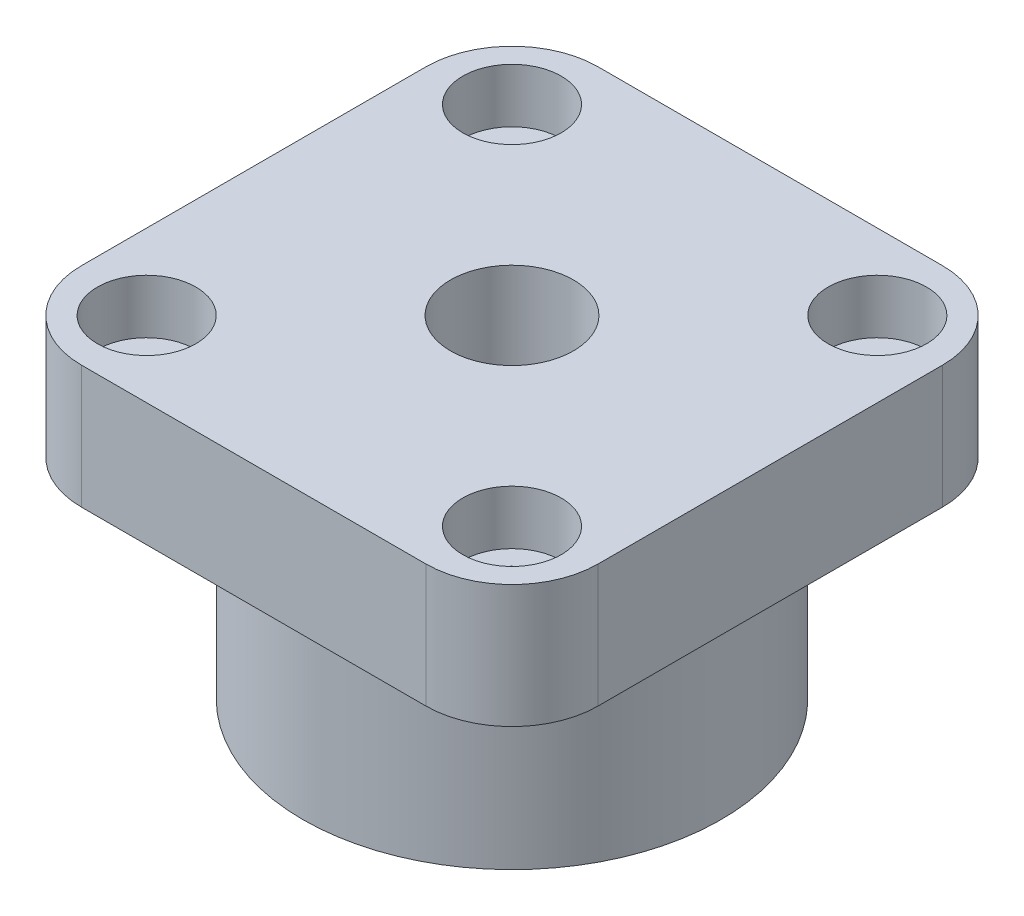
ISO-10303-21;
HEADER;
FILE_DESCRIPTION(('STEP AP214'),'2;1');
FILE_NAME('part.step','',(''),(''),'','','');
FILE_SCHEMA(('AUTOMOTIVE_DESIGN { 1 0 10303 214 1 1 1 1 }'));
ENDSEC;
DATA;
#1=APPLICATION_CONTEXT('core data for automotive mechanical design processes');
#2=APPLICATION_PROTOCOL_DEFINITION('international standard','automotive_design',2000,#1);
#3=PRODUCT_CONTEXT('',#1,'mechanical');
#4=PRODUCT('Part','Part','',(#3));
#5=PRODUCT_RELATED_PRODUCT_CATEGORY('part','',(#4));
#6=PRODUCT_DEFINITION_FORMATION('','',#4);
#7=PRODUCT_DEFINITION_CONTEXT('part definition',#1,'design');
#8=PRODUCT_DEFINITION('design','',#6,#7);
#9=PRODUCT_DEFINITION_SHAPE('','',#8);
#10=(LENGTH_UNIT() NAMED_UNIT(*) SI_UNIT(.MILLI.,.METRE.));
#11=(NAMED_UNIT(*) PLANE_ANGLE_UNIT() SI_UNIT($,.RADIAN.));
#12=(NAMED_UNIT(*) SI_UNIT($,.STERADIAN.) SOLID_ANGLE_UNIT());
#13=UNCERTAINTY_MEASURE_WITH_UNIT(LENGTH_MEASURE(1.E-05),#10,'distance_accuracy_value','');
#14=(GEOMETRIC_REPRESENTATION_CONTEXT(3) GLOBAL_UNCERTAINTY_ASSIGNED_CONTEXT((#13)) GLOBAL_UNIT_ASSIGNED_CONTEXT((#10,
#11,#12)) REPRESENTATION_CONTEXT('',''));
#15=CARTESIAN_POINT('',(0.,0.,0.));
#16=DIRECTION('',(0.,0.,1.));
#17=DIRECTION('',(1.,0.,0.));
#18=AXIS2_PLACEMENT_3D('',#15,#16,#17);
#19=CARTESIAN_POINT('',(0.,0.,0.));
#20=DIRECTION('',(0.,1.,0.));
#21=DIRECTION('',(0.,0.,1.));
#22=AXIS2_PLACEMENT_3D('',#19,#20,#21);
#23=PLANE('',#22);
#24=CARTESIAN_POINT('',(0.,0.,0.));
#25=DIRECTION('',(0.,1.,0.));
#26=DIRECTION('',(0.,0.,1.));
#27=AXIS2_PLACEMENT_3D('',#24,#25,#26);
#28=CIRCLE('',#27,17.);
#29=CARTESIAN_POINT('',(0.,0.,17.));
#30=VERTEX_POINT('',#29);
#31=EDGE_CURVE('E145',#30,#30,#28,.T.);
#32=ORIENTED_EDGE('',*,*,#31,.F.);
#33=EDGE_LOOP('',(#32));
#34=FACE_BOUND('',#33,.T.);
#35=CARTESIAN_POINT('',(0.,0.,0.));
#36=DIRECTION('',(0.,1.,0.));
#37=DIRECTION('',(0.,0.,1.));
#38=AXIS2_PLACEMENT_3D('',#35,#36,#37);
#39=CIRCLE('',#38,5.);
#40=CARTESIAN_POINT('',(0.,0.,5.));
#41=VERTEX_POINT('',#40);
#42=EDGE_CURVE('E142',#41,#41,#39,.T.);
#43=ORIENTED_EDGE('',*,*,#42,.T.);
#44=EDGE_LOOP('',(#43));
#45=FACE_BOUND('',#44,.T.);
#46=ADVANCED_FACE('F35',(#34,#45),#23,.F.);
#47=CARTESIAN_POINT('',(0.,17.,0.));
#48=DIRECTION('',(0.,-1.,0.));
#49=DIRECTION('',(0.,0.,-1.));
#50=AXIS2_PLACEMENT_3D('',#47,#48,#49);
#51=CYLINDRICAL_SURFACE('',#50,17.);
#52=CARTESIAN_POINT('',(0.,17.,0.));
#53=DIRECTION('',(0.,1.,0.));
#54=DIRECTION('',(0.,0.,1.));
#55=AXIS2_PLACEMENT_3D('',#52,#53,#54);
#56=CIRCLE('',#55,17.);
#57=CARTESIAN_POINT('',(0.,17.,17.));
#58=VERTEX_POINT('',#57);
#59=EDGE_CURVE('E147',#58,#58,#56,.T.);
#60=ORIENTED_EDGE('',*,*,#59,.F.);
#61=EDGE_LOOP('',(#60));
#62=FACE_BOUND('',#61,.T.);
#63=ORIENTED_EDGE('',*,*,#31,.T.);
#64=EDGE_LOOP('',(#63));
#65=FACE_BOUND('',#64,.T.);
#66=ADVANCED_FACE('F246',(#62,#65),#51,.T.);
#67=CARTESIAN_POINT('',(0.,17.,0.));
#68=DIRECTION('',(0.,-1.,0.));
#69=DIRECTION('',(0.,0.,-1.));
#70=AXIS2_PLACEMENT_3D('',#67,#68,#69);
#71=CYLINDRICAL_SURFACE('',#70,5.);
#72=ORIENTED_EDGE('',*,*,#42,.F.);
#73=EDGE_LOOP('',(#72));
#74=FACE_BOUND('',#73,.T.);
#75=CARTESIAN_POINT('',(0.,27.,0.));
#76=DIRECTION('',(0.,1.,0.));
#77=DIRECTION('',(0.,0.,1.));
#78=AXIS2_PLACEMENT_3D('',#75,#76,#77);
#79=CIRCLE('',#78,5.);
#80=CARTESIAN_POINT('',(0.,27.,5.));
#81=VERTEX_POINT('',#80);
#82=EDGE_CURVE('E136',#81,#81,#79,.T.);
#83=ORIENTED_EDGE('',*,*,#82,.T.);
#84=EDGE_LOOP('',(#83));
#85=FACE_BOUND('',#84,.T.);
#86=ADVANCED_FACE('F252',(#74,#85),#71,.F.);
#87=CARTESIAN_POINT('',(0.,17.,0.));
#88=DIRECTION('',(0.,1.,0.));
#89=DIRECTION('',(0.,0.,1.));
#90=AXIS2_PLACEMENT_3D('',#87,#88,#89);
#91=PLANE('',#90);
#92=CARTESIAN_POINT('',(-14.8492424049175,17.,-14.8492424049167));
#93=DIRECTION('',(0.,1.,0.));
#94=DIRECTION('',(0.,0.,1.));
#95=AXIS2_PLACEMENT_3D('',#92,#93,#94);
#96=CIRCLE('',#95,2.25);
#97=CARTESIAN_POINT('',(-14.8492424049175,17.,-12.5992424049167));
#98=VERTEX_POINT('',#97);
#99=EDGE_CURVE('E39',#98,#98,#96,.T.);
#100=ORIENTED_EDGE('',*,*,#99,.T.);
#101=EDGE_LOOP('',(#100));
#102=FACE_BOUND('',#101,.T.);
#103=CARTESIAN_POINT('',(14.8492424049175,17.,-14.8492424049175));
#104=DIRECTION('',(0.,1.,0.));
#105=DIRECTION('',(0.,0.,1.));
#106=AXIS2_PLACEMENT_3D('',#103,#104,#105);
#107=CIRCLE('',#106,2.25);
#108=CARTESIAN_POINT('',(14.8492424049175,17.,-12.5992424049175));
#109=VERTEX_POINT('',#108);
#110=EDGE_CURVE('E181',#109,#109,#107,.T.);
#111=ORIENTED_EDGE('',*,*,#110,.T.);
#112=EDGE_LOOP('',(#111));
#113=FACE_BOUND('',#112,.T.);
#114=CARTESIAN_POINT('',(14.8492424049183,17.,14.8492424049175));
#115=DIRECTION('',(0.,1.,0.));
#116=DIRECTION('',(0.,0.,1.));
#117=AXIS2_PLACEMENT_3D('',#114,#115,#116);
#118=CIRCLE('',#117,2.25);
#119=CARTESIAN_POINT('',(14.8492424049183,17.,17.0992424049175));
#120=VERTEX_POINT('',#119);
#121=EDGE_CURVE('E177',#120,#120,#118,.T.);
#122=ORIENTED_EDGE('',*,*,#121,.T.);
#123=EDGE_LOOP('',(#122));
#124=FACE_BOUND('',#123,.T.);
#125=CARTESIAN_POINT('',(-14.8492424049167,17.,14.8492424049183));
#126=DIRECTION('',(0.,1.,0.));
#127=DIRECTION('',(0.,0.,1.));
#128=AXIS2_PLACEMENT_3D('',#125,#126,#127);
#129=CIRCLE('',#128,2.25);
#130=CARTESIAN_POINT('',(-14.8492424049167,17.,17.0992424049183));
#131=VERTEX_POINT('',#130);
#132=EDGE_CURVE('E173',#131,#131,#129,.T.);
#133=ORIENTED_EDGE('',*,*,#132,.T.);
#134=EDGE_LOOP('',(#133));
#135=FACE_BOUND('',#134,.T.);
#136=DIRECTION('',(1.,0.,0.));
#137=VECTOR('',#136,1.);
#138=CARTESIAN_POINT('',(21.,17.,21.));
#139=LINE('',#138,#137);
#140=CARTESIAN_POINT('',(-14.,17.,21.));
#141=VERTEX_POINT('',#140);
#142=CARTESIAN_POINT('',(14.,17.,21.));
#143=VERTEX_POINT('',#142);
#144=EDGE_CURVE('E120',#141,#143,#139,.T.);
#145=ORIENTED_EDGE('',*,*,#144,.F.);
#146=CARTESIAN_POINT('',(-14.,17.,14.));
#147=DIRECTION('',(0.,1.,0.));
#148=DIRECTION('',(0.,0.,1.));
#149=AXIS2_PLACEMENT_3D('',#146,#147,#148);
#150=CIRCLE('',#149,7.);
#151=CARTESIAN_POINT('',(-21.,17.,14.));
#152=VERTEX_POINT('',#151);
#153=EDGE_CURVE('E103',#141,#152,#150,.F.);
#154=ORIENTED_EDGE('',*,*,#153,.T.);
#155=DIRECTION('',(0.,0.,1.));
#156=VECTOR('',#155,1.);
#157=CARTESIAN_POINT('',(-21.,17.,21.));
#158=LINE('',#157,#156);
#159=CARTESIAN_POINT('',(-21.,17.,-14.));
#160=VERTEX_POINT('',#159);
#161=EDGE_CURVE('E131',#160,#152,#158,.T.);
#162=ORIENTED_EDGE('',*,*,#161,.F.);
#163=CARTESIAN_POINT('',(-14.,17.,-14.));
#164=DIRECTION('',(0.,1.,0.));
#165=DIRECTION('',(0.,0.,1.));
#166=AXIS2_PLACEMENT_3D('',#163,#164,#165);
#167=CIRCLE('',#166,7.);
#168=CARTESIAN_POINT('',(-14.,17.,-21.));
#169=VERTEX_POINT('',#168);
#170=EDGE_CURVE('E124',#160,#169,#167,.F.);
#171=ORIENTED_EDGE('',*,*,#170,.T.);
#172=DIRECTION('',(-1.,0.,0.));
#173=VECTOR('',#172,1.);
#174=CARTESIAN_POINT('',(21.,17.,-21.));
#175=LINE('',#174,#173);
#176=CARTESIAN_POINT('',(14.,17.,-21.));
#177=VERTEX_POINT('',#176);
#178=EDGE_CURVE('E134',#177,#169,#175,.T.);
#179=ORIENTED_EDGE('',*,*,#178,.F.);
#180=CARTESIAN_POINT('',(14.,17.,-14.));
#181=DIRECTION('',(0.,1.,0.));
#182=DIRECTION('',(0.,0.,1.));
#183=AXIS2_PLACEMENT_3D('',#180,#181,#182);
#184=CIRCLE('',#183,7.);
#185=CARTESIAN_POINT('',(21.,17.,-14.));
#186=VERTEX_POINT('',#185);
#187=EDGE_CURVE('E154',#177,#186,#184,.F.);
#188=ORIENTED_EDGE('',*,*,#187,.T.);
#189=DIRECTION('',(0.,0.,-1.));
#190=VECTOR('',#189,1.);
#191=CARTESIAN_POINT('',(21.,17.,21.));
#192=LINE('',#191,#190);
#193=CARTESIAN_POINT('',(21.,17.,14.));
#194=VERTEX_POINT('',#193);
#195=EDGE_CURVE('E130',#194,#186,#192,.T.);
#196=ORIENTED_EDGE('',*,*,#195,.F.);
#197=CARTESIAN_POINT('',(14.,17.,14.));
#198=DIRECTION('',(0.,1.,0.));
#199=DIRECTION('',(0.,0.,1.));
#200=AXIS2_PLACEMENT_3D('',#197,#198,#199);
#201=CIRCLE('',#200,7.);
#202=EDGE_CURVE('E114',#194,#143,#201,.F.);
#203=ORIENTED_EDGE('',*,*,#202,.T.);
#204=EDGE_LOOP('',(#145,#154,#162,#171,#179,#188,#196,#203));
#205=FACE_BOUND('',#204,.T.);
#206=ORIENTED_EDGE('',*,*,#59,.T.);
#207=EDGE_LOOP('',(#206));
#208=FACE_BOUND('',#207,.T.);
#209=ADVANCED_FACE('F127',(#102,#113,#124,#135,#205,#208),#91,.F.);
#210=CARTESIAN_POINT('',(0.,27.,0.));
#211=DIRECTION('',(0.,1.,0.));
#212=DIRECTION('',(0.,0.,1.));
#213=AXIS2_PLACEMENT_3D('',#210,#211,#212);
#214=PLANE('',#213);
#215=CARTESIAN_POINT('',(-14.8492424049175,27.,-14.8492424049167));
#216=DIRECTION('',(0.,1.,0.));
#217=DIRECTION('',(0.,0.,1.));
#218=AXIS2_PLACEMENT_3D('',#215,#216,#217);
#219=CIRCLE('',#218,4.);
#220=CARTESIAN_POINT('',(-14.8492424049175,27.,-10.8492424049167));
#221=VERTEX_POINT('',#220);
#222=EDGE_CURVE('E329',#221,#221,#219,.T.);
#223=ORIENTED_EDGE('',*,*,#222,.F.);
#224=EDGE_LOOP('',(#223));
#225=FACE_BOUND('',#224,.T.);
#226=CARTESIAN_POINT('',(14.8492424049175,27.,-14.8492424049175));
#227=DIRECTION('',(0.,1.,0.));
#228=DIRECTION('',(0.,0.,1.));
#229=AXIS2_PLACEMENT_3D('',#226,#227,#228);
#230=CIRCLE('',#229,4.);
#231=CARTESIAN_POINT('',(14.8492424049175,27.,-10.8492424049175));
#232=VERTEX_POINT('',#231);
#233=EDGE_CURVE('E196',#232,#232,#230,.T.);
#234=ORIENTED_EDGE('',*,*,#233,.F.);
#235=EDGE_LOOP('',(#234));
#236=FACE_BOUND('',#235,.T.);
#237=CARTESIAN_POINT('',(14.8492424049183,27.,14.8492424049175));
#238=DIRECTION('',(0.,1.,0.));
#239=DIRECTION('',(0.,0.,1.));
#240=AXIS2_PLACEMENT_3D('',#237,#238,#239);
#241=CIRCLE('',#240,4.);
#242=CARTESIAN_POINT('',(14.8492424049183,27.,18.8492424049175));
#243=VERTEX_POINT('',#242);
#244=EDGE_CURVE('E183',#243,#243,#241,.T.);
#245=ORIENTED_EDGE('',*,*,#244,.F.);
#246=EDGE_LOOP('',(#245));
#247=FACE_BOUND('',#246,.T.);
#248=CARTESIAN_POINT('',(-14.8492424049167,27.,14.8492424049183));
#249=DIRECTION('',(0.,1.,0.));
#250=DIRECTION('',(0.,0.,1.));
#251=AXIS2_PLACEMENT_3D('',#248,#249,#250);
#252=CIRCLE('',#251,4.);
#253=CARTESIAN_POINT('',(-14.8492424049167,27.,18.8492424049183));
#254=VERTEX_POINT('',#253);
#255=EDGE_CURVE('E179',#254,#254,#252,.T.);
#256=ORIENTED_EDGE('',*,*,#255,.F.);
#257=EDGE_LOOP('',(#256));
#258=FACE_BOUND('',#257,.T.);
#259=DIRECTION('',(0.,0.,1.));
#260=VECTOR('',#259,1.);
#261=CARTESIAN_POINT('',(-21.,27.,21.));
#262=LINE('',#261,#260);
#263=CARTESIAN_POINT('',(-21.,27.,-14.));
#264=VERTEX_POINT('',#263);
#265=CARTESIAN_POINT('',(-21.,27.,14.));
#266=VERTEX_POINT('',#265);
#267=EDGE_CURVE('E141',#264,#266,#262,.T.);
#268=ORIENTED_EDGE('',*,*,#267,.T.);
#269=CARTESIAN_POINT('',(-14.,27.,14.));
#270=DIRECTION('',(0.,1.,0.));
#271=DIRECTION('',(0.,0.,1.));
#272=AXIS2_PLACEMENT_3D('',#269,#270,#271);
#273=CIRCLE('',#272,7.);
#274=CARTESIAN_POINT('',(-14.,27.,21.));
#275=VERTEX_POINT('',#274);
#276=EDGE_CURVE('E165',#266,#275,#273,.T.);
#277=ORIENTED_EDGE('',*,*,#276,.T.);
#278=DIRECTION('',(1.,0.,0.));
#279=VECTOR('',#278,1.);
#280=CARTESIAN_POINT('',(21.,27.,21.));
#281=LINE('',#280,#279);
#282=CARTESIAN_POINT('',(14.,27.,21.));
#283=VERTEX_POINT('',#282);
#284=EDGE_CURVE('E123',#275,#283,#281,.T.);
#285=ORIENTED_EDGE('',*,*,#284,.T.);
#286=CARTESIAN_POINT('',(14.,27.,14.));
#287=DIRECTION('',(0.,1.,0.));
#288=DIRECTION('',(0.,0.,1.));
#289=AXIS2_PLACEMENT_3D('',#286,#287,#288);
#290=CIRCLE('',#289,7.);
#291=CARTESIAN_POINT('',(21.,27.,14.));
#292=VERTEX_POINT('',#291);
#293=EDGE_CURVE('E163',#283,#292,#290,.T.);
#294=ORIENTED_EDGE('',*,*,#293,.T.);
#295=DIRECTION('',(0.,0.,-1.));
#296=VECTOR('',#295,1.);
#297=CARTESIAN_POINT('',(21.,27.,21.));
#298=LINE('',#297,#296);
#299=CARTESIAN_POINT('',(21.,27.,-14.));
#300=VERTEX_POINT('',#299);
#301=EDGE_CURVE('E216',#292,#300,#298,.T.);
#302=ORIENTED_EDGE('',*,*,#301,.T.);
#303=CARTESIAN_POINT('',(14.,27.,-14.));
#304=DIRECTION('',(0.,1.,0.));
#305=DIRECTION('',(0.,0.,1.));
#306=AXIS2_PLACEMENT_3D('',#303,#304,#305);
#307=CIRCLE('',#306,7.);
#308=CARTESIAN_POINT('',(14.,27.,-21.));
#309=VERTEX_POINT('',#308);
#310=EDGE_CURVE('E58',#300,#309,#307,.T.);
#311=ORIENTED_EDGE('',*,*,#310,.T.);
#312=DIRECTION('',(-1.,0.,0.));
#313=VECTOR('',#312,1.);
#314=CARTESIAN_POINT('',(21.,27.,-21.));
#315=LINE('',#314,#313);
#316=CARTESIAN_POINT('',(-14.,27.,-21.));
#317=VERTEX_POINT('',#316);
#318=EDGE_CURVE('E146',#309,#317,#315,.T.);
#319=ORIENTED_EDGE('',*,*,#318,.T.);
#320=CARTESIAN_POINT('',(-14.,27.,-14.));
#321=DIRECTION('',(0.,1.,0.));
#322=DIRECTION('',(0.,0.,1.));
#323=AXIS2_PLACEMENT_3D('',#320,#321,#322);
#324=CIRCLE('',#323,7.);
#325=EDGE_CURVE('E160',#317,#264,#324,.T.);
#326=ORIENTED_EDGE('',*,*,#325,.T.);
#327=EDGE_LOOP('',(#268,#277,#285,#294,#302,#311,#319,#326));
#328=FACE_BOUND('',#327,.T.);
#329=ORIENTED_EDGE('',*,*,#82,.F.);
#330=EDGE_LOOP('',(#329));
#331=FACE_BOUND('',#330,.T.);
#332=ADVANCED_FACE('F218',(#225,#236,#247,#258,#328,#331),#214,.T.);
#333=CARTESIAN_POINT('',(-21.,27.,21.));
#334=DIRECTION('',(1.,0.,0.));
#335=DIRECTION('',(0.,0.,-1.));
#336=AXIS2_PLACEMENT_3D('',#333,#334,#335);
#337=PLANE('',#336);
#338=ORIENTED_EDGE('',*,*,#161,.T.);
#339=DIRECTION('',(0.,-1.,0.));
#340=VECTOR('',#339,1.);
#341=CARTESIAN_POINT('',(-21.,27.,14.));
#342=LINE('',#341,#340);
#343=EDGE_CURVE('E108',#152,#266,#342,.F.);
#344=ORIENTED_EDGE('',*,*,#343,.T.);
#345=ORIENTED_EDGE('',*,*,#267,.F.);
#346=DIRECTION('',(0.,-1.,0.));
#347=VECTOR('',#346,1.);
#348=CARTESIAN_POINT('',(-21.,27.,-14.));
#349=LINE('',#348,#347);
#350=EDGE_CURVE('E113',#264,#160,#349,.T.);
#351=ORIENTED_EDGE('',*,*,#350,.T.);
#352=EDGE_LOOP('',(#338,#344,#345,#351));
#353=FACE_BOUND('',#352,.T.);
#354=ADVANCED_FACE('F225',(#353),#337,.F.);
#355=CARTESIAN_POINT('',(21.,27.,21.));
#356=DIRECTION('',(0.,0.,-1.));
#357=DIRECTION('',(-1.,0.,0.));
#358=AXIS2_PLACEMENT_3D('',#355,#356,#357);
#359=PLANE('',#358);
#360=ORIENTED_EDGE('',*,*,#284,.F.);
#361=DIRECTION('',(0.,-1.,0.));
#362=VECTOR('',#361,1.);
#363=CARTESIAN_POINT('',(-14.,27.,21.));
#364=LINE('',#363,#362);
#365=EDGE_CURVE('E107',#275,#141,#364,.T.);
#366=ORIENTED_EDGE('',*,*,#365,.T.);
#367=ORIENTED_EDGE('',*,*,#144,.T.);
#368=DIRECTION('',(0.,-1.,0.));
#369=VECTOR('',#368,1.);
#370=CARTESIAN_POINT('',(14.,27.,21.));
#371=LINE('',#370,#369);
#372=EDGE_CURVE('E125',#143,#283,#371,.F.);
#373=ORIENTED_EDGE('',*,*,#372,.T.);
#374=EDGE_LOOP('',(#360,#366,#367,#373));
#375=FACE_BOUND('',#374,.T.);
#376=ADVANCED_FACE('F119',(#375),#359,.F.);
#377=CARTESIAN_POINT('',(21.,27.,21.));
#378=DIRECTION('',(-1.,0.,0.));
#379=DIRECTION('',(0.,0.,1.));
#380=AXIS2_PLACEMENT_3D('',#377,#378,#379);
#381=PLANE('',#380);
#382=ORIENTED_EDGE('',*,*,#301,.F.);
#383=DIRECTION('',(0.,-1.,0.));
#384=VECTOR('',#383,1.);
#385=CARTESIAN_POINT('',(21.,27.,14.));
#386=LINE('',#385,#384);
#387=EDGE_CURVE('E169',#292,#194,#386,.T.);
#388=ORIENTED_EDGE('',*,*,#387,.T.);
#389=ORIENTED_EDGE('',*,*,#195,.T.);
#390=DIRECTION('',(0.,-1.,0.));
#391=VECTOR('',#390,1.);
#392=CARTESIAN_POINT('',(21.,27.,-14.));
#393=LINE('',#392,#391);
#394=EDGE_CURVE('E167',#186,#300,#393,.F.);
#395=ORIENTED_EDGE('',*,*,#394,.T.);
#396=EDGE_LOOP('',(#382,#388,#389,#395));
#397=FACE_BOUND('',#396,.T.);
#398=ADVANCED_FACE('F233',(#397),#381,.F.);
#399=CARTESIAN_POINT('',(21.,27.,-21.));
#400=DIRECTION('',(0.,0.,1.));
#401=DIRECTION('',(1.,0.,0.));
#402=AXIS2_PLACEMENT_3D('',#399,#400,#401);
#403=PLANE('',#402);
#404=ORIENTED_EDGE('',*,*,#318,.F.);
#405=DIRECTION('',(0.,-1.,0.));
#406=VECTOR('',#405,1.);
#407=CARTESIAN_POINT('',(14.,27.,-21.));
#408=LINE('',#407,#406);
#409=EDGE_CURVE('E11',#309,#177,#408,.T.);
#410=ORIENTED_EDGE('',*,*,#409,.T.);
#411=ORIENTED_EDGE('',*,*,#178,.T.);
#412=DIRECTION('',(0.,-1.,0.));
#413=VECTOR('',#412,1.);
#414=CARTESIAN_POINT('',(-14.,27.,-21.));
#415=LINE('',#414,#413);
#416=EDGE_CURVE('E44',#169,#317,#415,.F.);
#417=ORIENTED_EDGE('',*,*,#416,.T.);
#418=EDGE_LOOP('',(#404,#410,#411,#417));
#419=FACE_BOUND('',#418,.T.);
#420=ADVANCED_FACE('F227',(#419),#403,.F.);
#421=CARTESIAN_POINT('',(-14.,27.,14.));
#422=DIRECTION('',(0.,-1.,0.));
#423=DIRECTION('',(0.,0.,-1.));
#424=AXIS2_PLACEMENT_3D('',#421,#422,#423);
#425=CYLINDRICAL_SURFACE('',#424,7.);
#426=ORIENTED_EDGE('',*,*,#276,.F.);
#427=ORIENTED_EDGE('',*,*,#343,.F.);
#428=ORIENTED_EDGE('',*,*,#153,.F.);
#429=ORIENTED_EDGE('',*,*,#365,.F.);
#430=EDGE_LOOP('',(#426,#427,#428,#429));
#431=FACE_BOUND('',#430,.T.);
#432=ADVANCED_FACE('F106',(#431),#425,.T.);
#433=CARTESIAN_POINT('',(14.,27.,14.));
#434=DIRECTION('',(0.,-1.,0.));
#435=DIRECTION('',(0.,0.,-1.));
#436=AXIS2_PLACEMENT_3D('',#433,#434,#435);
#437=CYLINDRICAL_SURFACE('',#436,7.);
#438=ORIENTED_EDGE('',*,*,#293,.F.);
#439=ORIENTED_EDGE('',*,*,#372,.F.);
#440=ORIENTED_EDGE('',*,*,#202,.F.);
#441=ORIENTED_EDGE('',*,*,#387,.F.);
#442=EDGE_LOOP('',(#438,#439,#440,#441));
#443=FACE_BOUND('',#442,.T.);
#444=ADVANCED_FACE('F237',(#443),#437,.T.);
#445=CARTESIAN_POINT('',(14.,27.,-14.));
#446=DIRECTION('',(0.,-1.,0.));
#447=DIRECTION('',(0.,0.,-1.));
#448=AXIS2_PLACEMENT_3D('',#445,#446,#447);
#449=CYLINDRICAL_SURFACE('',#448,7.);
#450=ORIENTED_EDGE('',*,*,#310,.F.);
#451=ORIENTED_EDGE('',*,*,#394,.F.);
#452=ORIENTED_EDGE('',*,*,#187,.F.);
#453=ORIENTED_EDGE('',*,*,#409,.F.);
#454=EDGE_LOOP('',(#450,#451,#452,#453));
#455=FACE_BOUND('',#454,.T.);
#456=ADVANCED_FACE('F229',(#455),#449,.T.);
#457=CARTESIAN_POINT('',(-14.,27.,-14.));
#458=DIRECTION('',(0.,-1.,0.));
#459=DIRECTION('',(0.,0.,-1.));
#460=AXIS2_PLACEMENT_3D('',#457,#458,#459);
#461=CYLINDRICAL_SURFACE('',#460,7.);
#462=ORIENTED_EDGE('',*,*,#325,.F.);
#463=ORIENTED_EDGE('',*,*,#416,.F.);
#464=ORIENTED_EDGE('',*,*,#170,.F.);
#465=ORIENTED_EDGE('',*,*,#350,.F.);
#466=EDGE_LOOP('',(#462,#463,#464,#465));
#467=FACE_BOUND('',#466,.T.);
#468=ADVANCED_FACE('F37',(#467),#461,.T.);
#469=CARTESIAN_POINT('',(-14.8492424049167,27.,14.8492424049183));
#470=DIRECTION('',(0.,1.,0.));
#471=DIRECTION('',(0.,0.,1.));
#472=AXIS2_PLACEMENT_3D('',#469,#470,#471);
#473=CYLINDRICAL_SURFACE('',#472,2.25);
#474=CARTESIAN_POINT('',(-14.8492424049167,22.6,14.8492424049183));
#475=DIRECTION('',(0.,1.,0.));
#476=DIRECTION('',(0.,0.,1.));
#477=AXIS2_PLACEMENT_3D('',#474,#475,#476);
#478=CIRCLE('',#477,2.25);
#479=CARTESIAN_POINT('',(-14.8492424049167,22.6,17.0992424049183));
#480=VERTEX_POINT('',#479);
#481=EDGE_CURVE('E176',#480,#480,#478,.T.);
#482=ORIENTED_EDGE('',*,*,#481,.T.);
#483=EDGE_LOOP('',(#482));
#484=FACE_BOUND('',#483,.T.);
#485=ORIENTED_EDGE('',*,*,#132,.F.);
#486=EDGE_LOOP('',(#485));
#487=FACE_BOUND('',#486,.T.);
#488=ADVANCED_FACE('F275',(#484,#487),#473,.F.);
#489=CARTESIAN_POINT('',(-12.5992424049167,22.6,14.8492424049183));
#490=DIRECTION('',(0.,-1.,0.));
#491=DIRECTION('',(0.,0.,-1.));
#492=AXIS2_PLACEMENT_3D('',#489,#490,#491);
#493=PLANE('',#492);
#494=ORIENTED_EDGE('',*,*,#481,.F.);
#495=EDGE_LOOP('',(#494));
#496=FACE_BOUND('',#495,.T.);
#497=CARTESIAN_POINT('',(-14.8492424049167,22.6,14.8492424049183));
#498=DIRECTION('',(0.,1.,0.));
#499=DIRECTION('',(0.,0.,1.));
#500=AXIS2_PLACEMENT_3D('',#497,#498,#499);
#501=CIRCLE('',#500,4.);
#502=CARTESIAN_POINT('',(-14.8492424049167,22.6,18.8492424049183));
#503=VERTEX_POINT('',#502);
#504=EDGE_CURVE('E206',#503,#503,#501,.T.);
#505=ORIENTED_EDGE('',*,*,#504,.T.);
#506=EDGE_LOOP('',(#505));
#507=FACE_BOUND('',#506,.T.);
#508=ADVANCED_FACE('F278',(#496,#507),#493,.F.);
#509=CARTESIAN_POINT('',(-14.8492424049167,27.,14.8492424049183));
#510=DIRECTION('',(0.,1.,0.));
#511=DIRECTION('',(0.,0.,1.));
#512=AXIS2_PLACEMENT_3D('',#509,#510,#511);
#513=CYLINDRICAL_SURFACE('',#512,4.);
#514=ORIENTED_EDGE('',*,*,#504,.F.);
#515=EDGE_LOOP('',(#514));
#516=FACE_BOUND('',#515,.T.);
#517=ORIENTED_EDGE('',*,*,#255,.T.);
#518=EDGE_LOOP('',(#517));
#519=FACE_BOUND('',#518,.T.);
#520=ADVANCED_FACE('F282',(#516,#519),#513,.F.);
#521=CARTESIAN_POINT('',(14.8492424049183,27.,14.8492424049175));
#522=DIRECTION('',(0.,1.,0.));
#523=DIRECTION('',(0.,0.,1.));
#524=AXIS2_PLACEMENT_3D('',#521,#522,#523);
#525=CYLINDRICAL_SURFACE('',#524,2.25);
#526=CARTESIAN_POINT('',(14.8492424049183,22.6,14.8492424049175));
#527=DIRECTION('',(0.,1.,0.));
#528=DIRECTION('',(0.,0.,1.));
#529=AXIS2_PLACEMENT_3D('',#526,#527,#528);
#530=CIRCLE('',#529,2.25);
#531=CARTESIAN_POINT('',(14.8492424049183,22.6,17.0992424049175));
#532=VERTEX_POINT('',#531);
#533=EDGE_CURVE('E180',#532,#532,#530,.T.);
#534=ORIENTED_EDGE('',*,*,#533,.T.);
#535=EDGE_LOOP('',(#534));
#536=FACE_BOUND('',#535,.T.);
#537=ORIENTED_EDGE('',*,*,#121,.F.);
#538=EDGE_LOOP('',(#537));
#539=FACE_BOUND('',#538,.T.);
#540=ADVANCED_FACE('F286',(#536,#539),#525,.F.);
#541=CARTESIAN_POINT('',(17.0992424049183,22.6,14.8492424049175));
#542=DIRECTION('',(0.,-1.,0.));
#543=DIRECTION('',(0.,0.,-1.));
#544=AXIS2_PLACEMENT_3D('',#541,#542,#543);
#545=PLANE('',#544);
#546=ORIENTED_EDGE('',*,*,#533,.F.);
#547=EDGE_LOOP('',(#546));
#548=FACE_BOUND('',#547,.T.);
#549=CARTESIAN_POINT('',(14.8492424049183,22.6,14.8492424049175));
#550=DIRECTION('',(0.,1.,0.));
#551=DIRECTION('',(0.,0.,1.));
#552=AXIS2_PLACEMENT_3D('',#549,#550,#551);
#553=CIRCLE('',#552,4.);
#554=CARTESIAN_POINT('',(14.8492424049183,22.6,18.8492424049175));
#555=VERTEX_POINT('',#554);
#556=EDGE_CURVE('E188',#555,#555,#553,.T.);
#557=ORIENTED_EDGE('',*,*,#556,.T.);
#558=EDGE_LOOP('',(#557));
#559=FACE_BOUND('',#558,.T.);
#560=ADVANCED_FACE('F290',(#548,#559),#545,.F.);
#561=CARTESIAN_POINT('',(14.8492424049183,27.,14.8492424049175));
#562=DIRECTION('',(0.,1.,0.));
#563=DIRECTION('',(0.,0.,1.));
#564=AXIS2_PLACEMENT_3D('',#561,#562,#563);
#565=CYLINDRICAL_SURFACE('',#564,4.);
#566=ORIENTED_EDGE('',*,*,#556,.F.);
#567=EDGE_LOOP('',(#566));
#568=FACE_BOUND('',#567,.T.);
#569=ORIENTED_EDGE('',*,*,#244,.T.);
#570=EDGE_LOOP('',(#569));
#571=FACE_BOUND('',#570,.T.);
#572=ADVANCED_FACE('F294',(#568,#571),#565,.F.);
#573=CARTESIAN_POINT('',(14.8492424049175,27.,-14.8492424049175));
#574=DIRECTION('',(0.,1.,0.));
#575=DIRECTION('',(0.,0.,1.));
#576=AXIS2_PLACEMENT_3D('',#573,#574,#575);
#577=CYLINDRICAL_SURFACE('',#576,2.25);
#578=CARTESIAN_POINT('',(14.8492424049175,22.6,-14.8492424049175));
#579=DIRECTION('',(0.,1.,0.));
#580=DIRECTION('',(0.,0.,1.));
#581=AXIS2_PLACEMENT_3D('',#578,#579,#580);
#582=CIRCLE('',#581,2.25);
#583=CARTESIAN_POINT('',(14.8492424049175,22.6,-12.5992424049175));
#584=VERTEX_POINT('',#583);
#585=EDGE_CURVE('E184',#584,#584,#582,.T.);
#586=ORIENTED_EDGE('',*,*,#585,.T.);
#587=EDGE_LOOP('',(#586));
#588=FACE_BOUND('',#587,.T.);
#589=ORIENTED_EDGE('',*,*,#110,.F.);
#590=EDGE_LOOP('',(#589));
#591=FACE_BOUND('',#590,.T.);
#592=ADVANCED_FACE('F298',(#588,#591),#577,.F.);
#593=CARTESIAN_POINT('',(17.0992424049175,22.6,-14.8492424049175));
#594=DIRECTION('',(0.,-1.,0.));
#595=DIRECTION('',(0.,0.,-1.));
#596=AXIS2_PLACEMENT_3D('',#593,#594,#595);
#597=PLANE('',#596);
#598=ORIENTED_EDGE('',*,*,#585,.F.);
#599=EDGE_LOOP('',(#598));
#600=FACE_BOUND('',#599,.T.);
#601=CARTESIAN_POINT('',(14.8492424049175,22.6,-14.8492424049175));
#602=DIRECTION('',(0.,1.,0.));
#603=DIRECTION('',(0.,0.,1.));
#604=AXIS2_PLACEMENT_3D('',#601,#602,#603);
#605=CIRCLE('',#604,4.);
#606=CARTESIAN_POINT('',(14.8492424049175,22.6,-10.8492424049175));
#607=VERTEX_POINT('',#606);
#608=EDGE_CURVE('E191',#607,#607,#605,.T.);
#609=ORIENTED_EDGE('',*,*,#608,.T.);
#610=EDGE_LOOP('',(#609));
#611=FACE_BOUND('',#610,.T.);
#612=ADVANCED_FACE('F302',(#600,#611),#597,.F.);
#613=CARTESIAN_POINT('',(14.8492424049175,27.,-14.8492424049175));
#614=DIRECTION('',(0.,1.,0.));
#615=DIRECTION('',(0.,0.,1.));
#616=AXIS2_PLACEMENT_3D('',#613,#614,#615);
#617=CYLINDRICAL_SURFACE('',#616,4.);
#618=ORIENTED_EDGE('',*,*,#608,.F.);
#619=EDGE_LOOP('',(#618));
#620=FACE_BOUND('',#619,.T.);
#621=ORIENTED_EDGE('',*,*,#233,.T.);
#622=EDGE_LOOP('',(#621));
#623=FACE_BOUND('',#622,.T.);
#624=ADVANCED_FACE('F305',(#620,#623),#617,.F.);
#625=CARTESIAN_POINT('',(-14.8492424049175,27.,-14.8492424049167));
#626=DIRECTION('',(0.,1.,0.));
#627=DIRECTION('',(0.,0.,1.));
#628=AXIS2_PLACEMENT_3D('',#625,#626,#627);
#629=CYLINDRICAL_SURFACE('',#628,2.25);
#630=CARTESIAN_POINT('',(-14.8492424049175,22.6,-14.8492424049167));
#631=DIRECTION('',(0.,1.,0.));
#632=DIRECTION('',(0.,0.,1.));
#633=AXIS2_PLACEMENT_3D('',#630,#631,#632);
#634=CIRCLE('',#633,2.25);
#635=CARTESIAN_POINT('',(-14.8492424049175,22.6,-12.5992424049167));
#636=VERTEX_POINT('',#635);
#637=EDGE_CURVE('E331',#636,#636,#634,.T.);
#638=ORIENTED_EDGE('',*,*,#637,.T.);
#639=EDGE_LOOP('',(#638));
#640=FACE_BOUND('',#639,.T.);
#641=ORIENTED_EDGE('',*,*,#99,.F.);
#642=EDGE_LOOP('',(#641));
#643=FACE_BOUND('',#642,.T.);
#644=ADVANCED_FACE('F309',(#640,#643),#629,.F.);
#645=CARTESIAN_POINT('',(-12.5992424049175,22.6,-14.8492424049167));
#646=DIRECTION('',(0.,-1.,0.));
#647=DIRECTION('',(0.,0.,-1.));
#648=AXIS2_PLACEMENT_3D('',#645,#646,#647);
#649=PLANE('',#648);
#650=ORIENTED_EDGE('',*,*,#637,.F.);
#651=EDGE_LOOP('',(#650));
#652=FACE_BOUND('',#651,.T.);
#653=CARTESIAN_POINT('',(-14.8492424049175,22.6,-14.8492424049167));
#654=DIRECTION('',(0.,1.,0.));
#655=DIRECTION('',(0.,0.,1.));
#656=AXIS2_PLACEMENT_3D('',#653,#654,#655);
#657=CIRCLE('',#656,4.);
#658=CARTESIAN_POINT('',(-14.8492424049175,22.6,-10.8492424049167));
#659=VERTEX_POINT('',#658);
#660=EDGE_CURVE('E326',#659,#659,#657,.T.);
#661=ORIENTED_EDGE('',*,*,#660,.T.);
#662=EDGE_LOOP('',(#661));
#663=FACE_BOUND('',#662,.T.);
#664=ADVANCED_FACE('F313',(#652,#663),#649,.F.);
#665=CARTESIAN_POINT('',(-14.8492424049175,27.,-14.8492424049167));
#666=DIRECTION('',(0.,1.,0.));
#667=DIRECTION('',(0.,0.,1.));
#668=AXIS2_PLACEMENT_3D('',#665,#666,#667);
#669=CYLINDRICAL_SURFACE('',#668,4.);
#670=ORIENTED_EDGE('',*,*,#660,.F.);
#671=EDGE_LOOP('',(#670));
#672=FACE_BOUND('',#671,.T.);
#673=ORIENTED_EDGE('',*,*,#222,.T.);
#674=EDGE_LOOP('',(#673));
#675=FACE_BOUND('',#674,.T.);
#676=ADVANCED_FACE('F317',(#672,#675),#669,.F.);
#677=CLOSED_SHELL('',(#46,#66,#86,#209,#332,#354,#376,#398,#420,#432,#444,#456,#468,#488,#508,
#520,#540,#560,#572,#592,#612,#624,#644,#664,#676));
#678=MANIFOLD_SOLID_BREP('B2',#677);
#679=ADVANCED_BREP_SHAPE_REPRESENTATION('',(#18,#678),#14);
#680=SHAPE_DEFINITION_REPRESENTATION(#9,#679);
ENDSEC;
END-ISO-10303-21;
